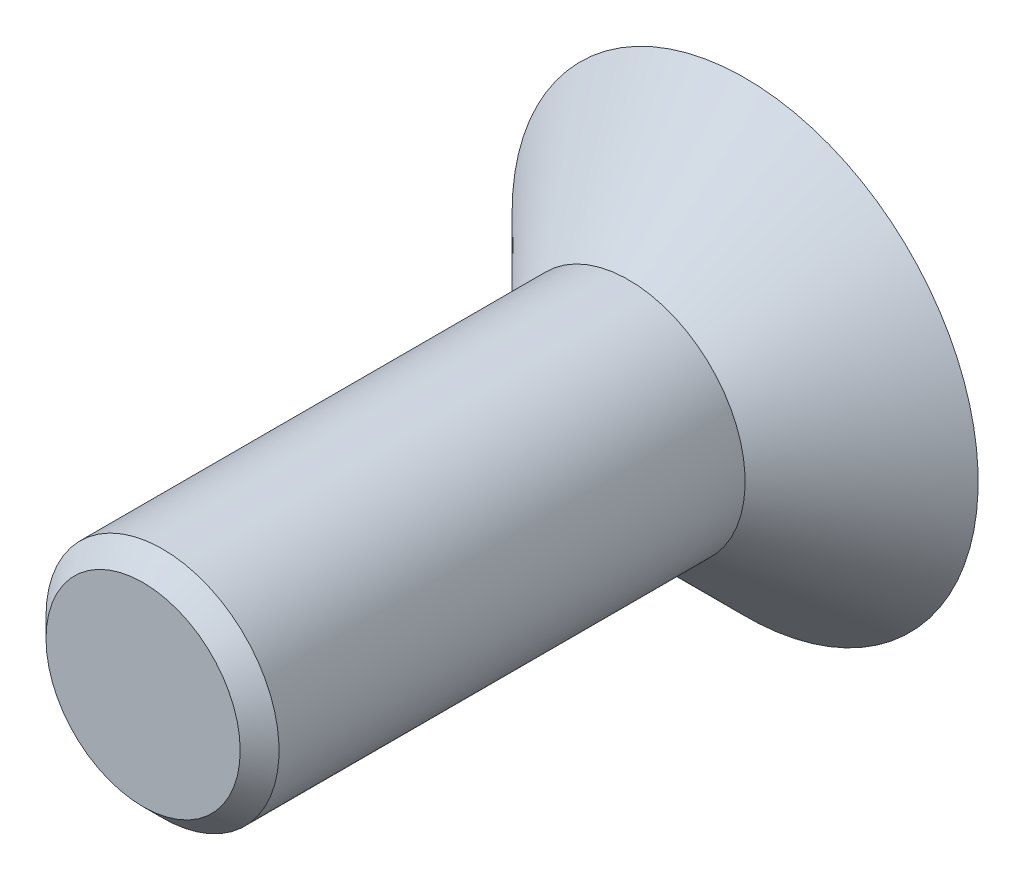
ISO-10303-21;
HEADER;
FILE_DESCRIPTION(('STEP AP214'),'2;1');
FILE_NAME('part.step','',(''),(''),'','','');
FILE_SCHEMA(('AUTOMOTIVE_DESIGN { 1 0 10303 214 1 1 1 1 }'));
ENDSEC;
DATA;
#1=APPLICATION_CONTEXT('core data for automotive mechanical design processes');
#2=APPLICATION_PROTOCOL_DEFINITION('international standard','automotive_design',2000,#1);
#3=PRODUCT_CONTEXT('',#1,'mechanical');
#4=PRODUCT('Part','Part','',(#3));
#5=PRODUCT_RELATED_PRODUCT_CATEGORY('part','',(#4));
#6=PRODUCT_DEFINITION_FORMATION('','',#4);
#7=PRODUCT_DEFINITION_CONTEXT('part definition',#1,'design');
#8=PRODUCT_DEFINITION('design','',#6,#7);
#9=PRODUCT_DEFINITION_SHAPE('','',#8);
#10=(LENGTH_UNIT() NAMED_UNIT(*) SI_UNIT(.MILLI.,.METRE.));
#11=(NAMED_UNIT(*) PLANE_ANGLE_UNIT() SI_UNIT($,.RADIAN.));
#12=(NAMED_UNIT(*) SI_UNIT($,.STERADIAN.) SOLID_ANGLE_UNIT());
#13=UNCERTAINTY_MEASURE_WITH_UNIT(LENGTH_MEASURE(1.E-05),#10,'distance_accuracy_value','');
#14=(GEOMETRIC_REPRESENTATION_CONTEXT(3) GLOBAL_UNCERTAINTY_ASSIGNED_CONTEXT((#13)) GLOBAL_UNIT_ASSIGNED_CONTEXT((#10,
#11,#12)) REPRESENTATION_CONTEXT('',''));
#15=CARTESIAN_POINT('',(0.,0.,0.));
#16=DIRECTION('',(0.,0.,1.));
#17=DIRECTION('',(1.,0.,0.));
#18=AXIS2_PLACEMENT_3D('',#15,#16,#17);
#19=CARTESIAN_POINT('',(0.,0.,0.));
#20=DIRECTION('',(0.,0.,-1.));
#21=DIRECTION('',(-1.,0.,0.));
#22=AXIS2_PLACEMENT_3D('',#19,#20,#21);
#23=PLANE('',#22);
#24=CARTESIAN_POINT('',(0.,0.,0.));
#25=DIRECTION('',(0.,0.,-1.));
#26=DIRECTION('',(-1.,0.,0.));
#27=AXIS2_PLACEMENT_3D('',#24,#25,#26);
#28=CIRCLE('',#27,4.99999999999999);
#29=CARTESIAN_POINT('',(-4.99999999999999,0.,0.));
#30=VERTEX_POINT('',#29);
#31=EDGE_CURVE('E10',#30,#30,#28,.F.);
#32=ORIENTED_EDGE('',*,*,#31,.T.);
#33=EDGE_LOOP('',(#32));
#34=FACE_BOUND('',#33,.T.);
#35=ADVANCED_FACE('F40',(#34),#23,.F.);
#36=CARTESIAN_POINT('',(0.,0.,-48.7261146496815));
#37=DIRECTION('',(0.,0.,-1.));
#38=DIRECTION('',(-1.,0.,0.));
#39=AXIS2_PLACEMENT_3D('',#36,#37,#38);
#40=CYLINDRICAL_SURFACE('',#39,6.00000000000001);
#41=CARTESIAN_POINT('',(0.,0.,-1.00000000000001));
#42=DIRECTION('',(0.,0.,-1.));
#43=DIRECTION('',(-1.,0.,0.));
#44=AXIS2_PLACEMENT_3D('',#41,#42,#43);
#45=CIRCLE('',#44,6.00000000000001);
#46=CARTESIAN_POINT('',(-6.00000000000001,0.,-1.00000000000001));
#47=VERTEX_POINT('',#46);
#48=EDGE_CURVE('E48',#47,#47,#45,.T.);
#49=ORIENTED_EDGE('',*,*,#48,.T.);
#50=EDGE_LOOP('',(#49));
#51=FACE_BOUND('',#50,.T.);
#52=CARTESIAN_POINT('',(0.,0.,-25.));
#53=DIRECTION('',(0.,0.,-1.));
#54=DIRECTION('',(-1.,0.,0.));
#55=AXIS2_PLACEMENT_3D('',#52,#53,#54);
#56=CIRCLE('',#55,6.00000000000001);
#57=CARTESIAN_POINT('',(-6.00000000000001,0.,-25.));
#58=VERTEX_POINT('',#57);
#59=EDGE_CURVE('E52',#58,#58,#56,.T.);
#60=ORIENTED_EDGE('',*,*,#59,.F.);
#61=EDGE_LOOP('',(#60));
#62=FACE_BOUND('',#61,.T.);
#63=ADVANCED_FACE('F85',(#51,#62),#40,.T.);
#64=CARTESIAN_POINT('',(0.,0.,-25.));
#65=DIRECTION('',(0.,0.,-1.));
#66=DIRECTION('',(-1.,0.,0.));
#67=AXIS2_PLACEMENT_3D('',#64,#65,#66);
#68=CONICAL_SURFACE('',#67,6.00000000000001,0.78539816339745);
#69=CARTESIAN_POINT('',(0.,0.,-31.));
#70=DIRECTION('',(0.,0.,-1.));
#71=DIRECTION('',(-1.,0.,0.));
#72=AXIS2_PLACEMENT_3D('',#69,#70,#71);
#73=CIRCLE('',#72,12.);
#74=CARTESIAN_POINT('',(-12.,0.,-31.));
#75=VERTEX_POINT('',#74);
#76=EDGE_CURVE('E56',#75,#75,#73,.T.);
#77=ORIENTED_EDGE('',*,*,#76,.F.);
#78=EDGE_LOOP('',(#77));
#79=FACE_BOUND('',#78,.T.);
#80=ORIENTED_EDGE('',*,*,#59,.T.);
#81=EDGE_LOOP('',(#80));
#82=FACE_BOUND('',#81,.T.);
#83=ADVANCED_FACE('F79',(#79,#82),#68,.T.);
#84=CARTESIAN_POINT('',(12.,0.,-31.));
#85=DIRECTION('',(0.,0.,1.));
#86=DIRECTION('',(1.,0.,0.));
#87=AXIS2_PLACEMENT_3D('',#84,#85,#86);
#88=PLANE('',#87);
#89=CARTESIAN_POINT('',(0.,0.,-31.));
#90=DIRECTION('',(0.,0.,-1.));
#91=DIRECTION('',(-1.,0.,0.));
#92=AXIS2_PLACEMENT_3D('',#89,#90,#91);
#93=CIRCLE('',#92,1.);
#94=CARTESIAN_POINT('',(-1.,0.,-31.));
#95=VERTEX_POINT('',#94);
#96=EDGE_CURVE('E61',#95,#95,#93,.T.);
#97=ORIENTED_EDGE('',*,*,#96,.F.);
#98=EDGE_LOOP('',(#97));
#99=FACE_BOUND('',#98,.T.);
#100=ORIENTED_EDGE('',*,*,#76,.T.);
#101=EDGE_LOOP('',(#100));
#102=FACE_BOUND('',#101,.T.);
#103=ADVANCED_FACE('F73',(#99,#102),#88,.F.);
#104=CARTESIAN_POINT('',(0.,0.,-48.7261146496815));
#105=DIRECTION('',(0.,0.,-1.));
#106=DIRECTION('',(-1.,0.,0.));
#107=AXIS2_PLACEMENT_3D('',#104,#105,#106);
#108=CYLINDRICAL_SURFACE('',#107,1.);
#109=CARTESIAN_POINT('',(0.,0.,-29.));
#110=DIRECTION('',(0.,0.,-1.));
#111=DIRECTION('',(-1.,0.,0.));
#112=AXIS2_PLACEMENT_3D('',#109,#110,#111);
#113=CIRCLE('',#112,1.00000000000001);
#114=CARTESIAN_POINT('',(-1.00000000000001,0.,-29.));
#115=VERTEX_POINT('',#114);
#116=EDGE_CURVE('E64',#115,#115,#113,.T.);
#117=ORIENTED_EDGE('',*,*,#116,.F.);
#118=EDGE_LOOP('',(#117));
#119=FACE_BOUND('',#118,.T.);
#120=ORIENTED_EDGE('',*,*,#96,.T.);
#121=EDGE_LOOP('',(#120));
#122=FACE_BOUND('',#121,.T.);
#123=ADVANCED_FACE('F70',(#119,#122),#108,.F.);
#124=CARTESIAN_POINT('',(1.00000000000001,0.,-29.));
#125=DIRECTION('',(0.,0.,1.));
#126=DIRECTION('',(1.,0.,0.));
#127=AXIS2_PLACEMENT_3D('',#124,#125,#126);
#128=PLANE('',#127);
#129=ORIENTED_EDGE('',*,*,#116,.T.);
#130=EDGE_LOOP('',(#129));
#131=FACE_BOUND('',#130,.T.);
#132=ADVANCED_FACE('F68',(#131),#128,.F.);
#133=CARTESIAN_POINT('',(0.,0.,-1.00000000000001));
#134=DIRECTION('',(0.,0.,-1.));
#135=DIRECTION('',(-1.,0.,0.));
#136=AXIS2_PLACEMENT_3D('',#133,#134,#135);
#137=CONICAL_SURFACE('',#136,6.00000000000001,0.78539816339745);
#138=ORIENTED_EDGE('',*,*,#31,.F.);
#139=EDGE_LOOP('',(#138));
#140=FACE_BOUND('',#139,.T.);
#141=ORIENTED_EDGE('',*,*,#48,.F.);
#142=EDGE_LOOP('',(#141));
#143=FACE_BOUND('',#142,.T.);
#144=ADVANCED_FACE('F43',(#140,#143),#137,.T.);
#145=CLOSED_SHELL('',(#35,#63,#83,#103,#123,#132,#144));
#146=MANIFOLD_SOLID_BREP('B2',#145);
#147=ADVANCED_BREP_SHAPE_REPRESENTATION('',(#18,#146),#14);
#148=SHAPE_DEFINITION_REPRESENTATION(#9,#147);
ENDSEC;
END-ISO-10303-21;
